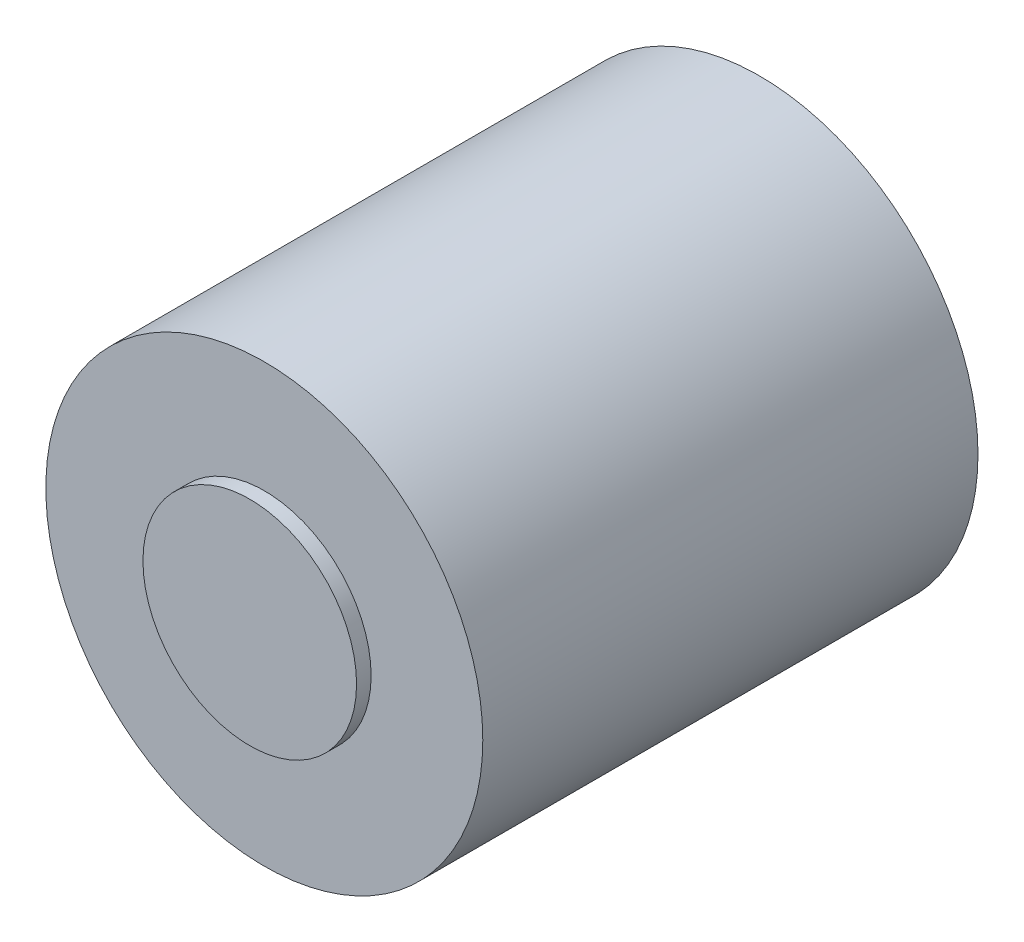
ISO-10303-21;
HEADER;
FILE_DESCRIPTION(('STEP AP214'),'2;1');
FILE_NAME('part.step','',(''),(''),'','','');
FILE_SCHEMA(('AUTOMOTIVE_DESIGN { 1 0 10303 214 1 1 1 1 }'));
ENDSEC;
DATA;
#1=APPLICATION_CONTEXT('core data for automotive mechanical design processes');
#2=APPLICATION_PROTOCOL_DEFINITION('international standard','automotive_design',2000,#1);
#3=PRODUCT_CONTEXT('',#1,'mechanical');
#4=PRODUCT('Part','Part','',(#3));
#5=PRODUCT_RELATED_PRODUCT_CATEGORY('part','',(#4));
#6=PRODUCT_DEFINITION_FORMATION('','',#4);
#7=PRODUCT_DEFINITION_CONTEXT('part definition',#1,'design');
#8=PRODUCT_DEFINITION('design','',#6,#7);
#9=PRODUCT_DEFINITION_SHAPE('','',#8);
#10=(LENGTH_UNIT() NAMED_UNIT(*) SI_UNIT(.MILLI.,.METRE.));
#11=(NAMED_UNIT(*) PLANE_ANGLE_UNIT() SI_UNIT($,.RADIAN.));
#12=(NAMED_UNIT(*) SI_UNIT($,.STERADIAN.) SOLID_ANGLE_UNIT());
#13=UNCERTAINTY_MEASURE_WITH_UNIT(LENGTH_MEASURE(1.E-05),#10,'distance_accuracy_value','');
#14=(GEOMETRIC_REPRESENTATION_CONTEXT(3) GLOBAL_UNCERTAINTY_ASSIGNED_CONTEXT((#13)) GLOBAL_UNIT_ASSIGNED_CONTEXT((#10,
#11,#12)) REPRESENTATION_CONTEXT('',''));
#15=CARTESIAN_POINT('',(0.,0.,0.));
#16=DIRECTION('',(0.,0.,1.));
#17=DIRECTION('',(1.,0.,0.));
#18=AXIS2_PLACEMENT_3D('',#15,#16,#17);
#19=CARTESIAN_POINT('',(0.,0.,1050.));
#20=DIRECTION('',(0.,0.,1.));
#21=DIRECTION('',(1.,0.,0.));
#22=AXIS2_PLACEMENT_3D('',#19,#20,#21);
#23=PLANE('',#22);
#24=CARTESIAN_POINT('',(0.,0.,1050.));
#25=DIRECTION('',(0.,0.,1.));
#26=DIRECTION('',(1.,0.,0.));
#27=AXIS2_PLACEMENT_3D('',#24,#25,#26);
#28=CIRCLE('',#27,220.);
#29=CARTESIAN_POINT('',(220.,0.,1050.));
#30=VERTEX_POINT('',#29);
#31=EDGE_CURVE('E9',#30,#30,#28,.T.);
#32=ORIENTED_EDGE('',*,*,#31,.T.);
#33=EDGE_LOOP('',(#32));
#34=FACE_BOUND('',#33,.T.);
#35=ADVANCED_FACE('F15',(#34),#23,.T.);
#36=CARTESIAN_POINT('',(0.,0.,1020.));
#37=DIRECTION('',(0.,0.,-1.));
#38=DIRECTION('',(1.,0.,0.));
#39=AXIS2_PLACEMENT_3D('',#36,#37,#38);
#40=CYLINDRICAL_SURFACE('',#39,220.);
#41=CARTESIAN_POINT('',(0.,0.,1020.));
#42=DIRECTION('',(0.,0.,1.));
#43=DIRECTION('',(1.,0.,0.));
#44=AXIS2_PLACEMENT_3D('',#41,#42,#43);
#45=CIRCLE('',#44,220.);
#46=CARTESIAN_POINT('',(220.,0.,1020.));
#47=VERTEX_POINT('',#46);
#48=EDGE_CURVE('E61',#47,#47,#45,.T.);
#49=ORIENTED_EDGE('',*,*,#48,.T.);
#50=DIRECTION('',(0.,0.,1.));
#51=VECTOR('',#50,1.);
#52=CARTESIAN_POINT('',(220.,0.,1020.));
#53=LINE('',#52,#51);
#54=EDGE_CURVE('E23',#47,#30,#53,.T.);
#55=ORIENTED_EDGE('',*,*,#54,.T.);
#56=ORIENTED_EDGE('',*,*,#31,.F.);
#57=ORIENTED_EDGE('',*,*,#54,.F.);
#58=EDGE_LOOP('',(#49,#55,#56,#57));
#59=FACE_BOUND('',#58,.T.);
#60=ADVANCED_FACE('F68',(#59),#40,.T.);
#61=CARTESIAN_POINT('',(0.,0.,1020.));
#62=DIRECTION('',(0.,0.,1.));
#63=DIRECTION('',(1.,0.,0.));
#64=AXIS2_PLACEMENT_3D('',#61,#62,#63);
#65=PLANE('',#64);
#66=ORIENTED_EDGE('',*,*,#48,.F.);
#67=EDGE_LOOP('',(#66));
#68=FACE_BOUND('',#67,.T.);
#69=CARTESIAN_POINT('',(0.,0.,1020.));
#70=DIRECTION('',(0.,0.,1.));
#71=DIRECTION('',(1.,0.,0.));
#72=AXIS2_PLACEMENT_3D('',#69,#70,#71);
#73=CIRCLE('',#72,450.);
#74=CARTESIAN_POINT('',(450.,0.,1020.));
#75=VERTEX_POINT('',#74);
#76=EDGE_CURVE('E55',#75,#75,#73,.T.);
#77=ORIENTED_EDGE('',*,*,#76,.T.);
#78=EDGE_LOOP('',(#77));
#79=FACE_BOUND('',#78,.T.);
#80=ADVANCED_FACE('F71',(#68,#79),#65,.T.);
#81=CARTESIAN_POINT('',(0.,0.,0.));
#82=DIRECTION('',(0.,0.,1.));
#83=DIRECTION('',(1.,0.,0.));
#84=AXIS2_PLACEMENT_3D('',#81,#82,#83);
#85=PLANE('',#84);
#86=CARTESIAN_POINT('',(0.,0.,0.));
#87=DIRECTION('',(0.,0.,1.));
#88=DIRECTION('',(1.,0.,0.));
#89=AXIS2_PLACEMENT_3D('',#86,#87,#88);
#90=CIRCLE('',#89,450.);
#91=CARTESIAN_POINT('',(450.,0.,0.));
#92=VERTEX_POINT('',#91);
#93=EDGE_CURVE('E54',#92,#92,#90,.T.);
#94=ORIENTED_EDGE('',*,*,#93,.F.);
#95=EDGE_LOOP('',(#94));
#96=FACE_BOUND('',#95,.T.);
#97=ADVANCED_FACE('F74',(#96),#85,.F.);
#98=CARTESIAN_POINT('',(0.,0.,0.));
#99=DIRECTION('',(0.,0.,-1.));
#100=DIRECTION('',(1.,0.,0.));
#101=AXIS2_PLACEMENT_3D('',#98,#99,#100);
#102=CYLINDRICAL_SURFACE('',#101,450.);
#103=ORIENTED_EDGE('',*,*,#93,.T.);
#104=DIRECTION('',(0.,0.,1.));
#105=VECTOR('',#104,1.);
#106=CARTESIAN_POINT('',(450.,0.,0.));
#107=LINE('',#106,#105);
#108=EDGE_CURVE('E51',#92,#75,#107,.T.);
#109=ORIENTED_EDGE('',*,*,#108,.T.);
#110=ORIENTED_EDGE('',*,*,#76,.F.);
#111=ORIENTED_EDGE('',*,*,#108,.F.);
#112=EDGE_LOOP('',(#103,#109,#110,#111));
#113=FACE_BOUND('',#112,.T.);
#114=ADVANCED_FACE('F52',(#113),#102,.T.);
#115=CLOSED_SHELL('',(#35,#60,#80,#97,#114));
#116=MANIFOLD_SOLID_BREP('B1',#115);
#117=ADVANCED_BREP_SHAPE_REPRESENTATION('',(#18,#116),#14);
#118=SHAPE_DEFINITION_REPRESENTATION(#9,#117);
ENDSEC;
END-ISO-10303-21;
